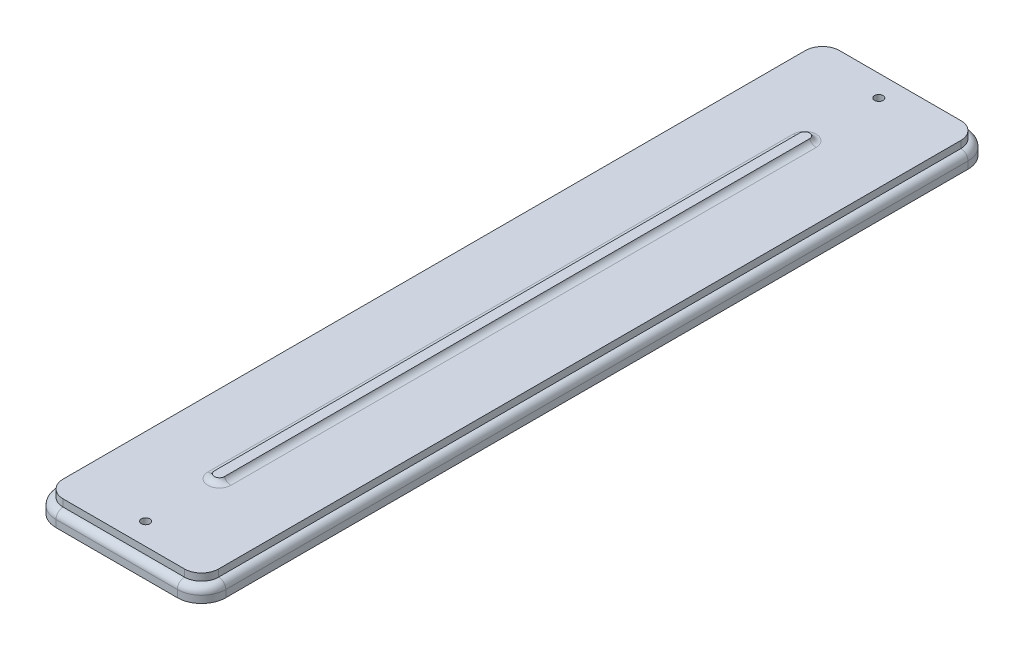
ISO-10303-21;
HEADER;
FILE_DESCRIPTION(('STEP AP214'),'2;1');
FILE_NAME('part.step','',(''),(''),'','','');
FILE_SCHEMA(('AUTOMOTIVE_DESIGN { 1 0 10303 214 1 1 1 1 }'));
ENDSEC;
DATA;
#1=APPLICATION_CONTEXT('core data for automotive mechanical design processes');
#2=APPLICATION_PROTOCOL_DEFINITION('international standard','automotive_design',2000,#1);
#3=PRODUCT_CONTEXT('',#1,'mechanical');
#4=PRODUCT('Part','Part','',(#3));
#5=PRODUCT_RELATED_PRODUCT_CATEGORY('part','',(#4));
#6=PRODUCT_DEFINITION_FORMATION('','',#4);
#7=PRODUCT_DEFINITION_CONTEXT('part definition',#1,'design');
#8=PRODUCT_DEFINITION('design','',#6,#7);
#9=PRODUCT_DEFINITION_SHAPE('','',#8);
#10=(LENGTH_UNIT() NAMED_UNIT(*) SI_UNIT(.MILLI.,.METRE.));
#11=(NAMED_UNIT(*) PLANE_ANGLE_UNIT() SI_UNIT($,.RADIAN.));
#12=(NAMED_UNIT(*) SI_UNIT($,.STERADIAN.) SOLID_ANGLE_UNIT());
#13=UNCERTAINTY_MEASURE_WITH_UNIT(LENGTH_MEASURE(1.E-05),#10,'distance_accuracy_value','');
#14=(GEOMETRIC_REPRESENTATION_CONTEXT(3) GLOBAL_UNCERTAINTY_ASSIGNED_CONTEXT((#13)) GLOBAL_UNIT_ASSIGNED_CONTEXT((#10,
#11,#12)) REPRESENTATION_CONTEXT('',''));
#15=CARTESIAN_POINT('',(0.,0.,0.));
#16=DIRECTION('',(0.,0.,1.));
#17=DIRECTION('',(1.,0.,0.));
#18=AXIS2_PLACEMENT_3D('',#15,#16,#17);
#19=CARTESIAN_POINT('',(-42.5,-15.,260.));
#20=DIRECTION('',(0.,1.,0.));
#21=DIRECTION('',(0.,0.,1.));
#22=AXIS2_PLACEMENT_3D('',#19,#20,#21);
#23=PLANE('',#22);
#24=CARTESIAN_POINT('',(-42.5,-15.,260.));
#25=DIRECTION('',(0.,-1.,0.));
#26=DIRECTION('',(0.,0.,1.));
#27=AXIS2_PLACEMENT_3D('',#24,#25,#26);
#28=CIRCLE('',#27,17.);
#29=CARTESIAN_POINT('',(-42.5,-15.,277.));
#30=VERTEX_POINT('',#29);
#31=CARTESIAN_POINT('',(-59.5,-15.,260.));
#32=VERTEX_POINT('',#31);
#33=EDGE_CURVE('E203',#30,#32,#28,.T.);
#34=ORIENTED_EDGE('',*,*,#33,.T.);
#35=DIRECTION('',(0.,0.,-1.));
#36=VECTOR('',#35,1.);
#37=CARTESIAN_POINT('',(-59.5,-15.,260.));
#38=LINE('',#37,#36);
#39=CARTESIAN_POINT('',(-59.5,-15.,-260.));
#40=VERTEX_POINT('',#39);
#41=EDGE_CURVE('E281',#32,#40,#38,.T.);
#42=ORIENTED_EDGE('',*,*,#41,.T.);
#43=CARTESIAN_POINT('',(-42.5,-15.,-260.));
#44=DIRECTION('',(0.,-1.,0.));
#45=DIRECTION('',(0.,0.,-1.));
#46=AXIS2_PLACEMENT_3D('',#43,#44,#45);
#47=CIRCLE('',#46,17.);
#48=CARTESIAN_POINT('',(-42.5,-15.,-277.));
#49=VERTEX_POINT('',#48);
#50=EDGE_CURVE('E284',#40,#49,#47,.T.);
#51=ORIENTED_EDGE('',*,*,#50,.T.);
#52=DIRECTION('',(1.,0.,0.));
#53=VECTOR('',#52,1.);
#54=CARTESIAN_POINT('',(-42.5,-15.,-277.));
#55=LINE('',#54,#53);
#56=CARTESIAN_POINT('',(42.5,-15.,-277.));
#57=VERTEX_POINT('',#56);
#58=EDGE_CURVE('E287',#49,#57,#55,.T.);
#59=ORIENTED_EDGE('',*,*,#58,.T.);
#60=CARTESIAN_POINT('',(42.5,-15.,-260.));
#61=DIRECTION('',(0.,-1.,0.));
#62=DIRECTION('',(0.,0.,-1.));
#63=AXIS2_PLACEMENT_3D('',#60,#61,#62);
#64=CIRCLE('',#63,17.0000000000001);
#65=CARTESIAN_POINT('',(59.5000000000001,-15.,-260.));
#66=VERTEX_POINT('',#65);
#67=EDGE_CURVE('E290',#57,#66,#64,.T.);
#68=ORIENTED_EDGE('',*,*,#67,.T.);
#69=DIRECTION('',(0.,0.,1.));
#70=VECTOR('',#69,1.);
#71=CARTESIAN_POINT('',(59.5,-15.,260.));
#72=LINE('',#71,#70);
#73=CARTESIAN_POINT('',(59.5,-15.,260.));
#74=VERTEX_POINT('',#73);
#75=EDGE_CURVE('E293',#66,#74,#72,.T.);
#76=ORIENTED_EDGE('',*,*,#75,.T.);
#77=CARTESIAN_POINT('',(42.5,-15.,260.));
#78=DIRECTION('',(0.,-1.,0.));
#79=DIRECTION('',(0.,0.,-1.));
#80=AXIS2_PLACEMENT_3D('',#77,#78,#79);
#81=CIRCLE('',#80,17.);
#82=CARTESIAN_POINT('',(42.5,-15.,277.));
#83=VERTEX_POINT('',#82);
#84=EDGE_CURVE('E296',#74,#83,#81,.T.);
#85=ORIENTED_EDGE('',*,*,#84,.T.);
#86=DIRECTION('',(-1.,0.,0.));
#87=VECTOR('',#86,1.);
#88=CARTESIAN_POINT('',(-42.5,-15.,277.));
#89=LINE('',#88,#87);
#90=EDGE_CURVE('E299',#83,#30,#89,.T.);
#91=ORIENTED_EDGE('',*,*,#90,.T.);
#92=EDGE_LOOP('',(#34,#42,#51,#59,#68,#76,#85,#91));
#93=FACE_BOUND('',#92,.T.);
#94=CARTESIAN_POINT('',(-42.5,-15.,260.));
#95=DIRECTION('',(0.,-1.,0.));
#96=DIRECTION('',(0.,0.,1.));
#97=AXIS2_PLACEMENT_3D('',#94,#95,#96);
#98=CIRCLE('',#97,12.);
#99=CARTESIAN_POINT('',(-42.5,-15.,272.));
#100=VERTEX_POINT('',#99);
#101=CARTESIAN_POINT('',(-54.5,-15.,260.));
#102=VERTEX_POINT('',#101);
#103=EDGE_CURVE('E182',#100,#102,#98,.T.);
#104=ORIENTED_EDGE('',*,*,#103,.F.);
#105=DIRECTION('',(-1.,0.,0.));
#106=VECTOR('',#105,1.);
#107=CARTESIAN_POINT('',(-42.5,-15.,272.));
#108=LINE('',#107,#106);
#109=CARTESIAN_POINT('',(42.5,-15.,272.));
#110=VERTEX_POINT('',#109);
#111=EDGE_CURVE('E228',#110,#100,#108,.T.);
#112=ORIENTED_EDGE('',*,*,#111,.F.);
#113=CARTESIAN_POINT('',(42.5,-15.,260.));
#114=DIRECTION('',(0.,-1.,0.));
#115=DIRECTION('',(0.,0.,1.));
#116=AXIS2_PLACEMENT_3D('',#113,#114,#115);
#117=CIRCLE('',#116,12.);
#118=CARTESIAN_POINT('',(54.5,-15.,260.));
#119=VERTEX_POINT('',#118);
#120=EDGE_CURVE('E224',#119,#110,#117,.T.);
#121=ORIENTED_EDGE('',*,*,#120,.F.);
#122=DIRECTION('',(0.,0.,1.));
#123=VECTOR('',#122,1.);
#124=CARTESIAN_POINT('',(54.5,-15.,-260.));
#125=LINE('',#124,#123);
#126=CARTESIAN_POINT('',(54.5,-15.,-260.));
#127=VERTEX_POINT('',#126);
#128=EDGE_CURVE('E221',#127,#119,#125,.T.);
#129=ORIENTED_EDGE('',*,*,#128,.F.);
#130=CARTESIAN_POINT('',(42.5,-15.,-260.));
#131=DIRECTION('',(0.,-1.,0.));
#132=DIRECTION('',(0.,0.,-1.));
#133=AXIS2_PLACEMENT_3D('',#130,#131,#132);
#134=CIRCLE('',#133,12.);
#135=CARTESIAN_POINT('',(42.5,-15.,-272.));
#136=VERTEX_POINT('',#135);
#137=EDGE_CURVE('E218',#136,#127,#134,.T.);
#138=ORIENTED_EDGE('',*,*,#137,.F.);
#139=DIRECTION('',(1.,0.,0.));
#140=VECTOR('',#139,1.);
#141=CARTESIAN_POINT('',(-42.5,-15.,-272.));
#142=LINE('',#141,#140);
#143=CARTESIAN_POINT('',(-42.5,-15.,-272.));
#144=VERTEX_POINT('',#143);
#145=EDGE_CURVE('E213',#144,#136,#142,.T.);
#146=ORIENTED_EDGE('',*,*,#145,.F.);
#147=CARTESIAN_POINT('',(-42.5,-15.,-260.));
#148=DIRECTION('',(0.,-1.,0.));
#149=DIRECTION('',(0.,0.,-1.));
#150=AXIS2_PLACEMENT_3D('',#147,#148,#149);
#151=CIRCLE('',#150,12.);
#152=CARTESIAN_POINT('',(-54.5,-15.,-260.));
#153=VERTEX_POINT('',#152);
#154=EDGE_CURVE('E208',#153,#144,#151,.T.);
#155=ORIENTED_EDGE('',*,*,#154,.F.);
#156=DIRECTION('',(0.,0.,-1.));
#157=VECTOR('',#156,1.);
#158=CARTESIAN_POINT('',(-54.5,-15.,260.));
#159=LINE('',#158,#157);
#160=EDGE_CURVE('E194',#102,#153,#159,.T.);
#161=ORIENTED_EDGE('',*,*,#160,.F.);
#162=EDGE_LOOP('',(#104,#112,#121,#129,#138,#146,#155,#161));
#163=FACE_BOUND('',#162,.T.);
#164=ADVANCED_FACE('F65',(#93,#163),#23,.F.);
#165=CARTESIAN_POINT('',(-42.5,-15.,260.));
#166=DIRECTION('',(0.,1.,0.));
#167=DIRECTION('',(0.,0.,1.));
#168=AXIS2_PLACEMENT_3D('',#165,#166,#167);
#169=CYLINDRICAL_SURFACE('',#168,17.);
#170=DIRECTION('',(0.,1.,0.));
#171=VECTOR('',#170,1.);
#172=CARTESIAN_POINT('',(-42.5,-15.,277.));
#173=LINE('',#172,#171);
#174=CARTESIAN_POINT('',(-42.5,-10.,277.));
#175=VERTEX_POINT('',#174);
#176=EDGE_CURVE('E302',#30,#175,#173,.T.);
#177=ORIENTED_EDGE('',*,*,#176,.T.);
#178=CARTESIAN_POINT('',(-42.5,-10.,260.));
#179=DIRECTION('',(0.,1.,0.));
#180=DIRECTION('',(0.,0.,1.));
#181=AXIS2_PLACEMENT_3D('',#178,#179,#180);
#182=CIRCLE('',#181,17.);
#183=CARTESIAN_POINT('',(-59.5,-10.,260.));
#184=VERTEX_POINT('',#183);
#185=EDGE_CURVE('E331',#175,#184,#182,.F.);
#186=ORIENTED_EDGE('',*,*,#185,.T.);
#187=DIRECTION('',(0.,1.,0.));
#188=VECTOR('',#187,1.);
#189=CARTESIAN_POINT('',(-59.5,-15.,260.));
#190=LINE('',#189,#188);
#191=EDGE_CURVE('E328',#32,#184,#190,.T.);
#192=ORIENTED_EDGE('',*,*,#191,.F.);
#193=ORIENTED_EDGE('',*,*,#33,.F.);
#194=EDGE_LOOP('',(#177,#186,#192,#193));
#195=FACE_BOUND('',#194,.T.);
#196=ADVANCED_FACE('F422',(#195),#169,.T.);
#197=CARTESIAN_POINT('',(-59.5,-15.,260.));
#198=DIRECTION('',(1.,0.,0.));
#199=DIRECTION('',(0.,0.,-1.));
#200=AXIS2_PLACEMENT_3D('',#197,#198,#199);
#201=PLANE('',#200);
#202=ORIENTED_EDGE('',*,*,#191,.T.);
#203=DIRECTION('',(0.,0.,-1.));
#204=VECTOR('',#203,1.);
#205=CARTESIAN_POINT('',(-59.4999999999999,-10.,-260.));
#206=LINE('',#205,#204);
#207=CARTESIAN_POINT('',(-59.5,-10.,-260.));
#208=VERTEX_POINT('',#207);
#209=EDGE_CURVE('E14',#184,#208,#206,.T.);
#210=ORIENTED_EDGE('',*,*,#209,.T.);
#211=DIRECTION('',(0.,1.,0.));
#212=VECTOR('',#211,1.);
#213=CARTESIAN_POINT('',(-59.5,-15.,-260.));
#214=LINE('',#213,#212);
#215=EDGE_CURVE('E325',#40,#208,#214,.T.);
#216=ORIENTED_EDGE('',*,*,#215,.F.);
#217=ORIENTED_EDGE('',*,*,#41,.F.);
#218=EDGE_LOOP('',(#202,#210,#216,#217));
#219=FACE_BOUND('',#218,.T.);
#220=ADVANCED_FACE('F466',(#219),#201,.F.);
#221=CARTESIAN_POINT('',(-42.5,-15.,-260.));
#222=DIRECTION('',(0.,1.,0.));
#223=DIRECTION('',(0.,0.,1.));
#224=AXIS2_PLACEMENT_3D('',#221,#222,#223);
#225=CYLINDRICAL_SURFACE('',#224,17.);
#226=ORIENTED_EDGE('',*,*,#215,.T.);
#227=CARTESIAN_POINT('',(-42.5,-10.,-260.));
#228=DIRECTION('',(0.,1.,0.));
#229=DIRECTION('',(0.,0.,1.));
#230=AXIS2_PLACEMENT_3D('',#227,#228,#229);
#231=CIRCLE('',#230,17.);
#232=CARTESIAN_POINT('',(-42.5,-10.,-277.));
#233=VERTEX_POINT('',#232);
#234=EDGE_CURVE('E75',#208,#233,#231,.F.);
#235=ORIENTED_EDGE('',*,*,#234,.T.);
#236=DIRECTION('',(0.,1.,0.));
#237=VECTOR('',#236,1.);
#238=CARTESIAN_POINT('',(-42.5,-15.,-277.));
#239=LINE('',#238,#237);
#240=EDGE_CURVE('E322',#49,#233,#239,.T.);
#241=ORIENTED_EDGE('',*,*,#240,.F.);
#242=ORIENTED_EDGE('',*,*,#50,.F.);
#243=EDGE_LOOP('',(#226,#235,#241,#242));
#244=FACE_BOUND('',#243,.T.);
#245=ADVANCED_FACE('F481',(#244),#225,.T.);
#246=CARTESIAN_POINT('',(-42.5,-15.,-277.));
#247=DIRECTION('',(0.,0.,1.));
#248=DIRECTION('',(1.,0.,0.));
#249=AXIS2_PLACEMENT_3D('',#246,#247,#248);
#250=PLANE('',#249);
#251=ORIENTED_EDGE('',*,*,#240,.T.);
#252=DIRECTION('',(1.,0.,0.));
#253=VECTOR('',#252,1.);
#254=CARTESIAN_POINT('',(42.5,-10.,-277.));
#255=LINE('',#254,#253);
#256=CARTESIAN_POINT('',(42.5,-10.,-277.));
#257=VERTEX_POINT('',#256);
#258=EDGE_CURVE('E347',#233,#257,#255,.T.);
#259=ORIENTED_EDGE('',*,*,#258,.T.);
#260=DIRECTION('',(0.,1.,0.));
#261=VECTOR('',#260,1.);
#262=CARTESIAN_POINT('',(42.5,-15.,-277.));
#263=LINE('',#262,#261);
#264=EDGE_CURVE('E318',#57,#257,#263,.T.);
#265=ORIENTED_EDGE('',*,*,#264,.F.);
#266=ORIENTED_EDGE('',*,*,#58,.F.);
#267=EDGE_LOOP('',(#251,#259,#265,#266));
#268=FACE_BOUND('',#267,.T.);
#269=ADVANCED_FACE('F439',(#268),#250,.F.);
#270=CARTESIAN_POINT('',(42.5,-15.,-260.));
#271=DIRECTION('',(0.,1.,0.));
#272=DIRECTION('',(0.,0.,1.));
#273=AXIS2_PLACEMENT_3D('',#270,#271,#272);
#274=CYLINDRICAL_SURFACE('',#273,17.0000000000001);
#275=ORIENTED_EDGE('',*,*,#264,.T.);
#276=CARTESIAN_POINT('',(42.5,-10.,-260.));
#277=DIRECTION('',(0.,1.,0.));
#278=DIRECTION('',(0.,0.,1.));
#279=AXIS2_PLACEMENT_3D('',#276,#277,#278);
#280=CIRCLE('',#279,17.0000000000001);
#281=CARTESIAN_POINT('',(59.5000000000001,-10.,-260.));
#282=VERTEX_POINT('',#281);
#283=EDGE_CURVE('E344',#257,#282,#280,.F.);
#284=ORIENTED_EDGE('',*,*,#283,.T.);
#285=DIRECTION('',(0.,1.,0.));
#286=VECTOR('',#285,1.);
#287=CARTESIAN_POINT('',(59.5000000000001,-15.,-260.));
#288=LINE('',#287,#286);
#289=EDGE_CURVE('E314',#66,#282,#288,.T.);
#290=ORIENTED_EDGE('',*,*,#289,.F.);
#291=ORIENTED_EDGE('',*,*,#67,.F.);
#292=EDGE_LOOP('',(#275,#284,#290,#291));
#293=FACE_BOUND('',#292,.T.);
#294=ADVANCED_FACE('F435',(#293),#274,.T.);
#295=CARTESIAN_POINT('',(59.5,-15.,260.));
#296=DIRECTION('',(-1.,0.,0.));
#297=DIRECTION('',(0.,0.,1.));
#298=AXIS2_PLACEMENT_3D('',#295,#296,#297);
#299=PLANE('',#298);
#300=ORIENTED_EDGE('',*,*,#289,.T.);
#301=DIRECTION('',(0.,0.,1.));
#302=VECTOR('',#301,1.);
#303=CARTESIAN_POINT('',(59.5,-10.,260.));
#304=LINE('',#303,#302);
#305=CARTESIAN_POINT('',(59.5,-10.,260.));
#306=VERTEX_POINT('',#305);
#307=EDGE_CURVE('E341',#282,#306,#304,.T.);
#308=ORIENTED_EDGE('',*,*,#307,.T.);
#309=DIRECTION('',(0.,1.,0.));
#310=VECTOR('',#309,1.);
#311=CARTESIAN_POINT('',(59.5,-15.,260.));
#312=LINE('',#311,#310);
#313=EDGE_CURVE('E310',#74,#306,#312,.T.);
#314=ORIENTED_EDGE('',*,*,#313,.F.);
#315=ORIENTED_EDGE('',*,*,#75,.F.);
#316=EDGE_LOOP('',(#300,#308,#314,#315));
#317=FACE_BOUND('',#316,.T.);
#318=ADVANCED_FACE('F431',(#317),#299,.F.);
#319=CARTESIAN_POINT('',(42.5,-15.,260.));
#320=DIRECTION('',(0.,1.,0.));
#321=DIRECTION('',(0.,0.,1.));
#322=AXIS2_PLACEMENT_3D('',#319,#320,#321);
#323=CYLINDRICAL_SURFACE('',#322,17.);
#324=ORIENTED_EDGE('',*,*,#313,.T.);
#325=CARTESIAN_POINT('',(42.5,-10.,260.));
#326=DIRECTION('',(0.,1.,0.));
#327=DIRECTION('',(0.,0.,1.));
#328=AXIS2_PLACEMENT_3D('',#325,#326,#327);
#329=CIRCLE('',#328,17.);
#330=CARTESIAN_POINT('',(42.5,-10.,277.));
#331=VERTEX_POINT('',#330);
#332=EDGE_CURVE('E338',#306,#331,#329,.F.);
#333=ORIENTED_EDGE('',*,*,#332,.T.);
#334=DIRECTION('',(0.,1.,0.));
#335=VECTOR('',#334,1.);
#336=CARTESIAN_POINT('',(42.5,-15.,277.));
#337=LINE('',#336,#335);
#338=EDGE_CURVE('E306',#83,#331,#337,.T.);
#339=ORIENTED_EDGE('',*,*,#338,.F.);
#340=ORIENTED_EDGE('',*,*,#84,.F.);
#341=EDGE_LOOP('',(#324,#333,#339,#340));
#342=FACE_BOUND('',#341,.T.);
#343=ADVANCED_FACE('F429',(#342),#323,.T.);
#344=CARTESIAN_POINT('',(-42.5,-15.,277.));
#345=DIRECTION('',(0.,0.,-1.));
#346=DIRECTION('',(-1.,0.,0.));
#347=AXIS2_PLACEMENT_3D('',#344,#345,#346);
#348=PLANE('',#347);
#349=ORIENTED_EDGE('',*,*,#338,.T.);
#350=DIRECTION('',(-1.,0.,0.));
#351=VECTOR('',#350,1.);
#352=CARTESIAN_POINT('',(-42.5,-10.,277.));
#353=LINE('',#352,#351);
#354=EDGE_CURVE('E335',#331,#175,#353,.T.);
#355=ORIENTED_EDGE('',*,*,#354,.T.);
#356=ORIENTED_EDGE('',*,*,#176,.F.);
#357=ORIENTED_EDGE('',*,*,#90,.F.);
#358=EDGE_LOOP('',(#349,#355,#356,#357));
#359=FACE_BOUND('',#358,.T.);
#360=ADVANCED_FACE('F417',(#359),#348,.F.);
#361=CARTESIAN_POINT('',(-42.5,-15.,260.));
#362=DIRECTION('',(0.,1.,0.));
#363=DIRECTION('',(0.,0.,1.));
#364=AXIS2_PLACEMENT_3D('',#361,#362,#363);
#365=CYLINDRICAL_SURFACE('',#364,12.);
#366=CARTESIAN_POINT('',(-42.5,-5.,260.));
#367=DIRECTION('',(0.,-1.,0.));
#368=DIRECTION('',(0.,0.,1.));
#369=AXIS2_PLACEMENT_3D('',#366,#367,#368);
#370=CIRCLE('',#369,12.);
#371=CARTESIAN_POINT('',(-42.5,-5.,272.));
#372=VERTEX_POINT('',#371);
#373=CARTESIAN_POINT('',(-54.5,-5.,260.));
#374=VERTEX_POINT('',#373);
#375=EDGE_CURVE('E231',#372,#374,#370,.T.);
#376=ORIENTED_EDGE('',*,*,#375,.F.);
#377=DIRECTION('',(0.,1.,0.));
#378=VECTOR('',#377,1.);
#379=CARTESIAN_POINT('',(-42.5,-15.,272.));
#380=LINE('',#379,#378);
#381=EDGE_CURVE('E189',#100,#372,#380,.T.);
#382=ORIENTED_EDGE('',*,*,#381,.F.);
#383=ORIENTED_EDGE('',*,*,#103,.T.);
#384=DIRECTION('',(0.,1.,0.));
#385=VECTOR('',#384,1.);
#386=CARTESIAN_POINT('',(-54.5,-15.,260.));
#387=LINE('',#386,#385);
#388=EDGE_CURVE('E186',#102,#374,#387,.T.);
#389=ORIENTED_EDGE('',*,*,#388,.T.);
#390=EDGE_LOOP('',(#376,#382,#383,#389));
#391=FACE_BOUND('',#390,.T.);
#392=ADVANCED_FACE('F185',(#391),#365,.F.);
#393=CARTESIAN_POINT('',(-54.5,-15.,260.));
#394=DIRECTION('',(1.,0.,0.));
#395=DIRECTION('',(0.,0.,-1.));
#396=AXIS2_PLACEMENT_3D('',#393,#394,#395);
#397=PLANE('',#396);
#398=DIRECTION('',(0.,0.,-1.));
#399=VECTOR('',#398,1.);
#400=CARTESIAN_POINT('',(-54.5,-5.,260.));
#401=LINE('',#400,#399);
#402=CARTESIAN_POINT('',(-54.5,-5.,-260.));
#403=VERTEX_POINT('',#402);
#404=EDGE_CURVE('E201',#374,#403,#401,.T.);
#405=ORIENTED_EDGE('',*,*,#404,.F.);
#406=ORIENTED_EDGE('',*,*,#388,.F.);
#407=ORIENTED_EDGE('',*,*,#160,.T.);
#408=DIRECTION('',(0.,1.,0.));
#409=VECTOR('',#408,1.);
#410=CARTESIAN_POINT('',(-54.5,-15.,-260.));
#411=LINE('',#410,#409);
#412=EDGE_CURVE('E204',#153,#403,#411,.T.);
#413=ORIENTED_EDGE('',*,*,#412,.T.);
#414=EDGE_LOOP('',(#405,#406,#407,#413));
#415=FACE_BOUND('',#414,.T.);
#416=ADVANCED_FACE('F198',(#415),#397,.T.);
#417=CARTESIAN_POINT('',(-42.5,-15.,-260.));
#418=DIRECTION('',(0.,1.,0.));
#419=DIRECTION('',(0.,0.,1.));
#420=AXIS2_PLACEMENT_3D('',#417,#418,#419);
#421=CYLINDRICAL_SURFACE('',#420,12.);
#422=CARTESIAN_POINT('',(-42.5,-5.,-260.));
#423=DIRECTION('',(0.,-1.,0.));
#424=DIRECTION('',(0.,0.,-1.));
#425=AXIS2_PLACEMENT_3D('',#422,#423,#424);
#426=CIRCLE('',#425,12.);
#427=CARTESIAN_POINT('',(-42.5,-5.,-272.));
#428=VERTEX_POINT('',#427);
#429=EDGE_CURVE('E236',#403,#428,#426,.T.);
#430=ORIENTED_EDGE('',*,*,#429,.F.);
#431=ORIENTED_EDGE('',*,*,#412,.F.);
#432=ORIENTED_EDGE('',*,*,#154,.T.);
#433=DIRECTION('',(0.,1.,0.));
#434=VECTOR('',#433,1.);
#435=CARTESIAN_POINT('',(-42.5,-15.,-272.));
#436=LINE('',#435,#434);
#437=EDGE_CURVE('E273',#144,#428,#436,.T.);
#438=ORIENTED_EDGE('',*,*,#437,.T.);
#439=EDGE_LOOP('',(#430,#431,#432,#438));
#440=FACE_BOUND('',#439,.T.);
#441=ADVANCED_FACE('F447',(#440),#421,.F.);
#442=CARTESIAN_POINT('',(-42.5,-15.,-272.));
#443=DIRECTION('',(0.,0.,1.));
#444=DIRECTION('',(1.,0.,0.));
#445=AXIS2_PLACEMENT_3D('',#442,#443,#444);
#446=PLANE('',#445);
#447=DIRECTION('',(1.,0.,0.));
#448=VECTOR('',#447,1.);
#449=CARTESIAN_POINT('',(-42.5,-5.,-272.));
#450=LINE('',#449,#448);
#451=CARTESIAN_POINT('',(42.5,-5.,-272.));
#452=VERTEX_POINT('',#451);
#453=EDGE_CURVE('E240',#428,#452,#450,.T.);
#454=ORIENTED_EDGE('',*,*,#453,.F.);
#455=ORIENTED_EDGE('',*,*,#437,.F.);
#456=ORIENTED_EDGE('',*,*,#145,.T.);
#457=DIRECTION('',(0.,1.,0.));
#458=VECTOR('',#457,1.);
#459=CARTESIAN_POINT('',(42.5,-15.,-272.));
#460=LINE('',#459,#458);
#461=EDGE_CURVE('E270',#136,#452,#460,.T.);
#462=ORIENTED_EDGE('',*,*,#461,.T.);
#463=EDGE_LOOP('',(#454,#455,#456,#462));
#464=FACE_BOUND('',#463,.T.);
#465=ADVANCED_FACE('F451',(#464),#446,.T.);
#466=CARTESIAN_POINT('',(42.5,-15.,-260.));
#467=DIRECTION('',(0.,1.,0.));
#468=DIRECTION('',(0.,0.,1.));
#469=AXIS2_PLACEMENT_3D('',#466,#467,#468);
#470=CYLINDRICAL_SURFACE('',#469,12.);
#471=CARTESIAN_POINT('',(42.5,-5.,-260.));
#472=DIRECTION('',(0.,-1.,0.));
#473=DIRECTION('',(0.,0.,-1.));
#474=AXIS2_PLACEMENT_3D('',#471,#472,#473);
#475=CIRCLE('',#474,12.);
#476=CARTESIAN_POINT('',(54.5,-5.,-260.));
#477=VERTEX_POINT('',#476);
#478=EDGE_CURVE('E244',#452,#477,#475,.T.);
#479=ORIENTED_EDGE('',*,*,#478,.F.);
#480=ORIENTED_EDGE('',*,*,#461,.F.);
#481=ORIENTED_EDGE('',*,*,#137,.T.);
#482=DIRECTION('',(0.,1.,0.));
#483=VECTOR('',#482,1.);
#484=CARTESIAN_POINT('',(54.5,-15.,-260.));
#485=LINE('',#484,#483);
#486=EDGE_CURVE('E267',#127,#477,#485,.T.);
#487=ORIENTED_EDGE('',*,*,#486,.T.);
#488=EDGE_LOOP('',(#479,#480,#481,#487));
#489=FACE_BOUND('',#488,.T.);
#490=ADVANCED_FACE('F394',(#489),#470,.F.);
#491=CARTESIAN_POINT('',(54.5,-15.,-260.));
#492=DIRECTION('',(-1.,0.,0.));
#493=DIRECTION('',(0.,0.,1.));
#494=AXIS2_PLACEMENT_3D('',#491,#492,#493);
#495=PLANE('',#494);
#496=DIRECTION('',(0.,0.,1.));
#497=VECTOR('',#496,1.);
#498=CARTESIAN_POINT('',(54.5,-5.,-260.));
#499=LINE('',#498,#497);
#500=CARTESIAN_POINT('',(54.5,-5.,260.));
#501=VERTEX_POINT('',#500);
#502=EDGE_CURVE('E248',#477,#501,#499,.T.);
#503=ORIENTED_EDGE('',*,*,#502,.F.);
#504=ORIENTED_EDGE('',*,*,#486,.F.);
#505=ORIENTED_EDGE('',*,*,#128,.T.);
#506=DIRECTION('',(0.,1.,0.));
#507=VECTOR('',#506,1.);
#508=CARTESIAN_POINT('',(54.5,-15.,260.));
#509=LINE('',#508,#507);
#510=EDGE_CURVE('E264',#119,#501,#509,.T.);
#511=ORIENTED_EDGE('',*,*,#510,.T.);
#512=EDGE_LOOP('',(#503,#504,#505,#511));
#513=FACE_BOUND('',#512,.T.);
#514=ADVANCED_FACE('F399',(#513),#495,.T.);
#515=CARTESIAN_POINT('',(42.5,-15.,260.));
#516=DIRECTION('',(0.,1.,0.));
#517=DIRECTION('',(0.,0.,1.));
#518=AXIS2_PLACEMENT_3D('',#515,#516,#517);
#519=CYLINDRICAL_SURFACE('',#518,12.);
#520=CARTESIAN_POINT('',(42.5,-5.,260.));
#521=DIRECTION('',(0.,-1.,0.));
#522=DIRECTION('',(0.,0.,1.));
#523=AXIS2_PLACEMENT_3D('',#520,#521,#522);
#524=CIRCLE('',#523,12.);
#525=CARTESIAN_POINT('',(42.5,-5.,272.));
#526=VERTEX_POINT('',#525);
#527=EDGE_CURVE('E252',#501,#526,#524,.T.);
#528=ORIENTED_EDGE('',*,*,#527,.F.);
#529=ORIENTED_EDGE('',*,*,#510,.F.);
#530=ORIENTED_EDGE('',*,*,#120,.T.);
#531=DIRECTION('',(0.,1.,0.));
#532=VECTOR('',#531,1.);
#533=CARTESIAN_POINT('',(42.5,-15.,272.));
#534=LINE('',#533,#532);
#535=EDGE_CURVE('E261',#110,#526,#534,.T.);
#536=ORIENTED_EDGE('',*,*,#535,.T.);
#537=EDGE_LOOP('',(#528,#529,#530,#536));
#538=FACE_BOUND('',#537,.T.);
#539=ADVANCED_FACE('F404',(#538),#519,.F.);
#540=CARTESIAN_POINT('',(-42.5,-15.,272.));
#541=DIRECTION('',(0.,0.,-1.));
#542=DIRECTION('',(-1.,0.,0.));
#543=AXIS2_PLACEMENT_3D('',#540,#541,#542);
#544=PLANE('',#543);
#545=DIRECTION('',(-1.,0.,0.));
#546=VECTOR('',#545,1.);
#547=CARTESIAN_POINT('',(-42.5,-5.,272.));
#548=LINE('',#547,#546);
#549=EDGE_CURVE('E195',#526,#372,#548,.T.);
#550=ORIENTED_EDGE('',*,*,#549,.F.);
#551=ORIENTED_EDGE('',*,*,#535,.F.);
#552=ORIENTED_EDGE('',*,*,#111,.T.);
#553=ORIENTED_EDGE('',*,*,#381,.T.);
#554=EDGE_LOOP('',(#550,#551,#552,#553));
#555=FACE_BOUND('',#554,.T.);
#556=ADVANCED_FACE('F453',(#555),#544,.T.);
#557=CARTESIAN_POINT('',(42.5,-10.,-260.));
#558=DIRECTION('',(0.,1.,0.));
#559=DIRECTION('',(0.,0.,1.));
#560=AXIS2_PLACEMENT_3D('',#557,#558,#559);
#561=TOROIDAL_SURFACE('',#560,12.0000000000001,5.);
#562=CARTESIAN_POINT('',(42.5,-10.,-272.));
#563=DIRECTION('',(-1.,0.,0.));
#564=DIRECTION('',(0.,0.,1.));
#565=AXIS2_PLACEMENT_3D('',#562,#563,#564);
#566=CIRCLE('',#565,5.);
#567=EDGE_CURVE('E373',#452,#257,#566,.T.);
#568=ORIENTED_EDGE('',*,*,#567,.F.);
#569=ORIENTED_EDGE('',*,*,#478,.T.);
#570=CARTESIAN_POINT('',(54.5000000000001,-10.,-260.));
#571=DIRECTION('',(0.,0.,1.));
#572=DIRECTION('',(1.,0.,0.));
#573=AXIS2_PLACEMENT_3D('',#570,#571,#572);
#574=CIRCLE('',#573,5.);
#575=EDGE_CURVE('E69',#282,#477,#574,.T.);
#576=ORIENTED_EDGE('',*,*,#575,.F.);
#577=ORIENTED_EDGE('',*,*,#283,.F.);
#578=EDGE_LOOP('',(#568,#569,#576,#577));
#579=FACE_BOUND('',#578,.T.);
#580=ADVANCED_FACE('F67',(#579),#561,.T.);
#581=CARTESIAN_POINT('',(54.5,-10.,260.));
#582=DIRECTION('',(0.,0.,-1.));
#583=DIRECTION('',(-1.,0.,0.));
#584=AXIS2_PLACEMENT_3D('',#581,#582,#583);
#585=CYLINDRICAL_SURFACE('',#584,5.);
#586=ORIENTED_EDGE('',*,*,#575,.T.);
#587=ORIENTED_EDGE('',*,*,#502,.T.);
#588=CARTESIAN_POINT('',(54.5,-10.,260.));
#589=DIRECTION('',(0.,0.,1.));
#590=DIRECTION('',(1.,0.,0.));
#591=AXIS2_PLACEMENT_3D('',#588,#589,#590);
#592=CIRCLE('',#591,5.);
#593=EDGE_CURVE('E370',#306,#501,#592,.T.);
#594=ORIENTED_EDGE('',*,*,#593,.F.);
#595=ORIENTED_EDGE('',*,*,#307,.F.);
#596=EDGE_LOOP('',(#586,#587,#594,#595));
#597=FACE_BOUND('',#596,.T.);
#598=ADVANCED_FACE('F386',(#597),#585,.T.);
#599=CARTESIAN_POINT('',(-42.5,-10.,-272.));
#600=DIRECTION('',(-1.,0.,0.));
#601=DIRECTION('',(0.,0.,1.));
#602=AXIS2_PLACEMENT_3D('',#599,#600,#601);
#603=CYLINDRICAL_SURFACE('',#602,5.);
#604=ORIENTED_EDGE('',*,*,#567,.T.);
#605=ORIENTED_EDGE('',*,*,#258,.F.);
#606=CARTESIAN_POINT('',(-42.5,-10.,-272.));
#607=DIRECTION('',(-1.,0.,0.));
#608=DIRECTION('',(0.,0.,1.));
#609=AXIS2_PLACEMENT_3D('',#606,#607,#608);
#610=CIRCLE('',#609,5.);
#611=EDGE_CURVE('E366',#428,#233,#610,.T.);
#612=ORIENTED_EDGE('',*,*,#611,.F.);
#613=ORIENTED_EDGE('',*,*,#453,.T.);
#614=EDGE_LOOP('',(#604,#605,#612,#613));
#615=FACE_BOUND('',#614,.T.);
#616=ADVANCED_FACE('F441',(#615),#603,.T.);
#617=CARTESIAN_POINT('',(42.5,-10.,260.));
#618=DIRECTION('',(0.,1.,0.));
#619=DIRECTION('',(0.,0.,1.));
#620=AXIS2_PLACEMENT_3D('',#617,#618,#619);
#621=TOROIDAL_SURFACE('',#620,12.,5.);
#622=ORIENTED_EDGE('',*,*,#593,.T.);
#623=ORIENTED_EDGE('',*,*,#527,.T.);
#624=CARTESIAN_POINT('',(42.5,-10.,272.));
#625=DIRECTION('',(-1.,0.,0.));
#626=DIRECTION('',(0.,0.,1.));
#627=AXIS2_PLACEMENT_3D('',#624,#625,#626);
#628=CIRCLE('',#627,5.);
#629=EDGE_CURVE('E362',#331,#526,#628,.T.);
#630=ORIENTED_EDGE('',*,*,#629,.F.);
#631=ORIENTED_EDGE('',*,*,#332,.F.);
#632=EDGE_LOOP('',(#622,#623,#630,#631));
#633=FACE_BOUND('',#632,.T.);
#634=ADVANCED_FACE('F408',(#633),#621,.T.);
#635=CARTESIAN_POINT('',(-42.5,-10.,-260.));
#636=DIRECTION('',(0.,1.,0.));
#637=DIRECTION('',(0.,0.,1.));
#638=AXIS2_PLACEMENT_3D('',#635,#636,#637);
#639=TOROIDAL_SURFACE('',#638,12.,5.);
#640=ORIENTED_EDGE('',*,*,#611,.T.);
#641=ORIENTED_EDGE('',*,*,#234,.F.);
#642=CARTESIAN_POINT('',(-54.5,-10.,-260.));
#643=DIRECTION('',(0.,0.,1.));
#644=DIRECTION('',(1.,0.,0.));
#645=AXIS2_PLACEMENT_3D('',#642,#643,#644);
#646=CIRCLE('',#645,5.);
#647=EDGE_CURVE('E358',#403,#208,#646,.T.);
#648=ORIENTED_EDGE('',*,*,#647,.F.);
#649=ORIENTED_EDGE('',*,*,#429,.T.);
#650=EDGE_LOOP('',(#640,#641,#648,#649));
#651=FACE_BOUND('',#650,.T.);
#652=ADVANCED_FACE('F443',(#651),#639,.T.);
#653=CARTESIAN_POINT('',(-42.5,-10.,272.));
#654=DIRECTION('',(1.,0.,0.));
#655=DIRECTION('',(0.,0.,-1.));
#656=AXIS2_PLACEMENT_3D('',#653,#654,#655);
#657=CYLINDRICAL_SURFACE('',#656,5.);
#658=ORIENTED_EDGE('',*,*,#629,.T.);
#659=ORIENTED_EDGE('',*,*,#549,.T.);
#660=CARTESIAN_POINT('',(-42.5,-10.,272.));
#661=DIRECTION('',(-1.,0.,0.));
#662=DIRECTION('',(0.,0.,1.));
#663=AXIS2_PLACEMENT_3D('',#660,#661,#662);
#664=CIRCLE('',#663,5.);
#665=EDGE_CURVE('E355',#175,#372,#664,.T.);
#666=ORIENTED_EDGE('',*,*,#665,.F.);
#667=ORIENTED_EDGE('',*,*,#354,.F.);
#668=EDGE_LOOP('',(#658,#659,#666,#667));
#669=FACE_BOUND('',#668,.T.);
#670=ADVANCED_FACE('F412',(#669),#657,.T.);
#671=CARTESIAN_POINT('',(-54.5,-10.,260.));
#672=DIRECTION('',(0.,0.,1.));
#673=DIRECTION('',(1.,0.,0.));
#674=AXIS2_PLACEMENT_3D('',#671,#672,#673);
#675=CYLINDRICAL_SURFACE('',#674,5.);
#676=ORIENTED_EDGE('',*,*,#647,.T.);
#677=ORIENTED_EDGE('',*,*,#209,.F.);
#678=CARTESIAN_POINT('',(-54.5,-10.,260.));
#679=DIRECTION('',(0.,0.,1.));
#680=DIRECTION('',(1.,0.,0.));
#681=AXIS2_PLACEMENT_3D('',#678,#679,#680);
#682=CIRCLE('',#681,5.);
#683=EDGE_CURVE('E352',#374,#184,#682,.T.);
#684=ORIENTED_EDGE('',*,*,#683,.F.);
#685=ORIENTED_EDGE('',*,*,#404,.T.);
#686=EDGE_LOOP('',(#676,#677,#684,#685));
#687=FACE_BOUND('',#686,.T.);
#688=ADVANCED_FACE('F489',(#687),#675,.T.);
#689=CARTESIAN_POINT('',(-42.5,-10.,260.));
#690=DIRECTION('',(0.,1.,0.));
#691=DIRECTION('',(0.,0.,1.));
#692=AXIS2_PLACEMENT_3D('',#689,#690,#691);
#693=TOROIDAL_SURFACE('',#692,12.,5.);
#694=ORIENTED_EDGE('',*,*,#665,.T.);
#695=ORIENTED_EDGE('',*,*,#375,.T.);
#696=ORIENTED_EDGE('',*,*,#683,.T.);
#697=ORIENTED_EDGE('',*,*,#185,.F.);
#698=EDGE_LOOP('',(#694,#695,#696,#697));
#699=FACE_BOUND('',#698,.T.);
#700=ADVANCED_FACE('F486',(#699),#693,.T.);
#701=CLOSED_SHELL('',(#164,#196,#220,#245,#269,#294,#318,#343,#360,#392,#416,#441,#465,#490,
#514,#539,#556,#580,#598,#616,#634,#652,#670,#688,#700));
#702=MANIFOLD_SOLID_BREP('B2',#701);
#703=CARTESIAN_POINT('',(-42.5,0.,-260.));
#704=DIRECTION('',(0.,-1.,0.));
#705=DIRECTION('',(0.,0.,-1.));
#706=AXIS2_PLACEMENT_3D('',#703,#704,#705);
#707=PLANE('',#706);
#708=DIRECTION('',(0.,0.,1.));
#709=VECTOR('',#708,1.);
#710=CARTESIAN_POINT('',(8.08257569495583,0.,-260.));
#711=LINE('',#710,#709);
#712=CARTESIAN_POINT('',(8.08257569495583,0.,-205.));
#713=VERTEX_POINT('',#712);
#714=CARTESIAN_POINT('',(8.08257569495583,0.,205.));
#715=VERTEX_POINT('',#714);
#716=EDGE_CURVE('E975',#713,#715,#711,.T.);
#717=ORIENTED_EDGE('',*,*,#716,.T.);
#718=CARTESIAN_POINT('',(0.,0.,205.));
#719=DIRECTION('',(0.,-1.,0.));
#720=DIRECTION('',(0.,0.,-1.));
#721=AXIS2_PLACEMENT_3D('',#718,#719,#720);
#722=CIRCLE('',#721,8.08257569495585);
#723=CARTESIAN_POINT('',(-8.08257569495588,0.,205.));
#724=VERTEX_POINT('',#723);
#725=EDGE_CURVE('E63',#715,#724,#722,.T.);
#726=ORIENTED_EDGE('',*,*,#725,.T.);
#727=DIRECTION('',(0.,0.,-1.));
#728=VECTOR('',#727,1.);
#729=CARTESIAN_POINT('',(-8.08257569495588,0.,-260.));
#730=LINE('',#729,#728);
#731=CARTESIAN_POINT('',(-8.08257569495584,0.,-205.));
#732=VERTEX_POINT('',#731);
#733=EDGE_CURVE('E782',#724,#732,#730,.T.);
#734=ORIENTED_EDGE('',*,*,#733,.T.);
#735=CARTESIAN_POINT('',(0.,0.,-205.));
#736=DIRECTION('',(0.,-1.,0.));
#737=DIRECTION('',(0.,0.,-1.));
#738=AXIS2_PLACEMENT_3D('',#735,#736,#737);
#739=CIRCLE('',#738,8.08257569495585);
#740=EDGE_CURVE('E877',#732,#713,#739,.T.);
#741=ORIENTED_EDGE('',*,*,#740,.T.);
#742=EDGE_LOOP('',(#717,#726,#734,#741));
#743=FACE_BOUND('',#742,.T.);
#744=CARTESIAN_POINT('',(-42.5,0.,-260.));
#745=DIRECTION('',(0.,1.,0.));
#746=DIRECTION('',(0.,0.,-1.));
#747=AXIS2_PLACEMENT_3D('',#744,#745,#746);
#748=CIRCLE('',#747,12.);
#749=CARTESIAN_POINT('',(-42.5,0.,-272.));
#750=VERTEX_POINT('',#749);
#751=CARTESIAN_POINT('',(-54.5,0.,-260.));
#752=VERTEX_POINT('',#751);
#753=EDGE_CURVE('E904',#750,#752,#748,.T.);
#754=ORIENTED_EDGE('',*,*,#753,.T.);
#755=DIRECTION('',(0.,0.,1.));
#756=VECTOR('',#755,1.);
#757=CARTESIAN_POINT('',(-54.5,0.,-260.));
#758=LINE('',#757,#756);
#759=CARTESIAN_POINT('',(-54.5,0.,260.));
#760=VERTEX_POINT('',#759);
#761=EDGE_CURVE('E945',#752,#760,#758,.T.);
#762=ORIENTED_EDGE('',*,*,#761,.T.);
#763=CARTESIAN_POINT('',(-42.5,0.,260.));
#764=DIRECTION('',(0.,1.,0.));
#765=DIRECTION('',(0.,0.,1.));
#766=AXIS2_PLACEMENT_3D('',#763,#764,#765);
#767=CIRCLE('',#766,12.);
#768=CARTESIAN_POINT('',(-42.5,0.,272.));
#769=VERTEX_POINT('',#768);
#770=EDGE_CURVE('E949',#760,#769,#767,.T.);
#771=ORIENTED_EDGE('',*,*,#770,.T.);
#772=DIRECTION('',(1.,0.,0.));
#773=VECTOR('',#772,1.);
#774=CARTESIAN_POINT('',(-42.5,0.,272.));
#775=LINE('',#774,#773);
#776=CARTESIAN_POINT('',(42.5,0.,272.));
#777=VERTEX_POINT('',#776);
#778=EDGE_CURVE('E953',#769,#777,#775,.T.);
#779=ORIENTED_EDGE('',*,*,#778,.T.);
#780=CARTESIAN_POINT('',(42.5,0.,260.));
#781=DIRECTION('',(0.,1.,0.));
#782=DIRECTION('',(0.,0.,1.));
#783=AXIS2_PLACEMENT_3D('',#780,#781,#782);
#784=CIRCLE('',#783,12.);
#785=CARTESIAN_POINT('',(54.5,0.,260.));
#786=VERTEX_POINT('',#785);
#787=EDGE_CURVE('E957',#777,#786,#784,.T.);
#788=ORIENTED_EDGE('',*,*,#787,.T.);
#789=DIRECTION('',(0.,0.,-1.));
#790=VECTOR('',#789,1.);
#791=CARTESIAN_POINT('',(54.5,0.,-260.));
#792=LINE('',#791,#790);
#793=CARTESIAN_POINT('',(54.5,0.,-260.));
#794=VERTEX_POINT('',#793);
#795=EDGE_CURVE('E961',#786,#794,#792,.T.);
#796=ORIENTED_EDGE('',*,*,#795,.T.);
#797=CARTESIAN_POINT('',(42.5,0.,-260.));
#798=DIRECTION('',(0.,1.,0.));
#799=DIRECTION('',(0.,0.,-1.));
#800=AXIS2_PLACEMENT_3D('',#797,#798,#799);
#801=CIRCLE('',#800,12.);
#802=CARTESIAN_POINT('',(42.5,0.,-272.));
#803=VERTEX_POINT('',#802);
#804=EDGE_CURVE('E965',#794,#803,#801,.T.);
#805=ORIENTED_EDGE('',*,*,#804,.T.);
#806=DIRECTION('',(-1.,0.,0.));
#807=VECTOR('',#806,1.);
#808=CARTESIAN_POINT('',(-42.5,0.,-272.));
#809=LINE('',#808,#807);
#810=EDGE_CURVE('E913',#803,#750,#809,.T.);
#811=ORIENTED_EDGE('',*,*,#810,.T.);
#812=EDGE_LOOP('',(#754,#762,#771,#779,#788,#796,#805,#811));
#813=FACE_BOUND('',#812,.T.);
#814=CARTESIAN_POINT('',(0.,0.,-257.));
#815=DIRECTION('',(0.,1.,0.));
#816=DIRECTION('',(0.,0.,1.));
#817=AXIS2_PLACEMENT_3D('',#814,#815,#816);
#818=CIRCLE('',#817,3.);
#819=CARTESIAN_POINT('',(0.,0.,-254.));
#820=VERTEX_POINT('',#819);
#821=EDGE_CURVE('E896',#820,#820,#818,.T.);
#822=ORIENTED_EDGE('',*,*,#821,.F.);
#823=EDGE_LOOP('',(#822));
#824=FACE_BOUND('',#823,.T.);
#825=CARTESIAN_POINT('',(0.,0.,256.72));
#826=DIRECTION('',(0.,1.,0.));
#827=DIRECTION('',(0.,0.,1.));
#828=AXIS2_PLACEMENT_3D('',#825,#826,#827);
#829=CIRCLE('',#828,3.);
#830=CARTESIAN_POINT('',(0.,0.,259.72));
#831=VERTEX_POINT('',#830);
#832=EDGE_CURVE('E891',#831,#831,#829,.T.);
#833=ORIENTED_EDGE('',*,*,#832,.F.);
#834=EDGE_LOOP('',(#833));
#835=FACE_BOUND('',#834,.T.);
#836=ADVANCED_FACE('F772',(#743,#813,#824,#835),#707,.F.);
#837=CARTESIAN_POINT('',(-42.5,-5.,-260.));
#838=DIRECTION('',(0.,1.,0.));
#839=DIRECTION('',(0.,0.,1.));
#840=AXIS2_PLACEMENT_3D('',#837,#838,#839);
#841=CYLINDRICAL_SURFACE('',#840,12.);
#842=ORIENTED_EDGE('',*,*,#753,.F.);
#843=DIRECTION('',(0.,1.,0.));
#844=VECTOR('',#843,1.);
#845=CARTESIAN_POINT('',(-42.5,-5.,-272.));
#846=LINE('',#845,#844);
#847=CARTESIAN_POINT('',(-42.5,-5.,-272.));
#848=VERTEX_POINT('',#847);
#849=EDGE_CURVE('E972',#848,#750,#846,.T.);
#850=ORIENTED_EDGE('',*,*,#849,.F.);
#851=CARTESIAN_POINT('',(-42.5,-5.,-260.));
#852=DIRECTION('',(0.,1.,0.));
#853=DIRECTION('',(0.,0.,-1.));
#854=AXIS2_PLACEMENT_3D('',#851,#852,#853);
#855=CIRCLE('',#854,12.);
#856=CARTESIAN_POINT('',(-54.5,-5.,-260.));
#857=VERTEX_POINT('',#856);
#858=EDGE_CURVE('E908',#848,#857,#855,.T.);
#859=ORIENTED_EDGE('',*,*,#858,.T.);
#860=DIRECTION('',(0.,1.,0.));
#861=VECTOR('',#860,1.);
#862=CARTESIAN_POINT('',(-54.5,-5.,-260.));
#863=LINE('',#862,#861);
#864=EDGE_CURVE('E941',#857,#752,#863,.T.);
#865=ORIENTED_EDGE('',*,*,#864,.T.);
#866=EDGE_LOOP('',(#842,#850,#859,#865));
#867=FACE_BOUND('',#866,.T.);
#868=ADVANCED_FACE('F1022',(#867),#841,.T.);
#869=CARTESIAN_POINT('',(-42.5,-5.,-272.));
#870=DIRECTION('',(0.,0.,-1.));
#871=DIRECTION('',(-1.,0.,0.));
#872=AXIS2_PLACEMENT_3D('',#869,#870,#871);
#873=PLANE('',#872);
#874=ORIENTED_EDGE('',*,*,#810,.F.);
#875=DIRECTION('',(0.,1.,0.));
#876=VECTOR('',#875,1.);
#877=CARTESIAN_POINT('',(42.5,-5.,-272.));
#878=LINE('',#877,#876);
#879=CARTESIAN_POINT('',(42.5,-5.,-272.));
#880=VERTEX_POINT('',#879);
#881=EDGE_CURVE('E976',#880,#803,#878,.T.);
#882=ORIENTED_EDGE('',*,*,#881,.F.);
#883=DIRECTION('',(-1.,0.,0.));
#884=VECTOR('',#883,1.);
#885=CARTESIAN_POINT('',(-42.5,-5.,-272.));
#886=LINE('',#885,#884);
#887=EDGE_CURVE('E937',#880,#848,#886,.T.);
#888=ORIENTED_EDGE('',*,*,#887,.T.);
#889=ORIENTED_EDGE('',*,*,#849,.T.);
#890=EDGE_LOOP('',(#874,#882,#888,#889));
#891=FACE_BOUND('',#890,.T.);
#892=ADVANCED_FACE('F1027',(#891),#873,.T.);
#893=CARTESIAN_POINT('',(42.5,-5.,-260.));
#894=DIRECTION('',(0.,1.,0.));
#895=DIRECTION('',(0.,0.,1.));
#896=AXIS2_PLACEMENT_3D('',#893,#894,#895);
#897=CYLINDRICAL_SURFACE('',#896,12.);
#898=ORIENTED_EDGE('',*,*,#804,.F.);
#899=DIRECTION('',(0.,1.,0.));
#900=VECTOR('',#899,1.);
#901=CARTESIAN_POINT('',(54.5,-5.,-260.));
#902=LINE('',#901,#900);
#903=CARTESIAN_POINT('',(54.5,-5.,-260.));
#904=VERTEX_POINT('',#903);
#905=EDGE_CURVE('E979',#904,#794,#902,.T.);
#906=ORIENTED_EDGE('',*,*,#905,.F.);
#907=CARTESIAN_POINT('',(42.5,-5.,-260.));
#908=DIRECTION('',(0.,1.,0.));
#909=DIRECTION('',(0.,0.,-1.));
#910=AXIS2_PLACEMENT_3D('',#907,#908,#909);
#911=CIRCLE('',#910,12.);
#912=EDGE_CURVE('E933',#904,#880,#911,.T.);
#913=ORIENTED_EDGE('',*,*,#912,.T.);
#914=ORIENTED_EDGE('',*,*,#881,.T.);
#915=EDGE_LOOP('',(#898,#906,#913,#914));
#916=FACE_BOUND('',#915,.T.);
#917=ADVANCED_FACE('F1035',(#916),#897,.T.);
#918=CARTESIAN_POINT('',(54.5,-5.,-260.));
#919=DIRECTION('',(1.,0.,0.));
#920=DIRECTION('',(0.,0.,-1.));
#921=AXIS2_PLACEMENT_3D('',#918,#919,#920);
#922=PLANE('',#921);
#923=ORIENTED_EDGE('',*,*,#795,.F.);
#924=DIRECTION('',(0.,1.,0.));
#925=VECTOR('',#924,1.);
#926=CARTESIAN_POINT('',(54.5,-5.,260.));
#927=LINE('',#926,#925);
#928=CARTESIAN_POINT('',(54.5,-5.,260.));
#929=VERTEX_POINT('',#928);
#930=EDGE_CURVE('E982',#929,#786,#927,.T.);
#931=ORIENTED_EDGE('',*,*,#930,.F.);
#932=DIRECTION('',(0.,0.,-1.));
#933=VECTOR('',#932,1.);
#934=CARTESIAN_POINT('',(54.5,-5.,-260.));
#935=LINE('',#934,#933);
#936=EDGE_CURVE('E929',#929,#904,#935,.T.);
#937=ORIENTED_EDGE('',*,*,#936,.T.);
#938=ORIENTED_EDGE('',*,*,#905,.T.);
#939=EDGE_LOOP('',(#923,#931,#937,#938));
#940=FACE_BOUND('',#939,.T.);
#941=ADVANCED_FACE('F1039',(#940),#922,.T.);
#942=CARTESIAN_POINT('',(42.5,-5.,260.));
#943=DIRECTION('',(0.,1.,0.));
#944=DIRECTION('',(0.,0.,1.));
#945=AXIS2_PLACEMENT_3D('',#942,#943,#944);
#946=CYLINDRICAL_SURFACE('',#945,12.);
#947=ORIENTED_EDGE('',*,*,#787,.F.);
#948=DIRECTION('',(0.,1.,0.));
#949=VECTOR('',#948,1.);
#950=CARTESIAN_POINT('',(42.5,-5.,272.));
#951=LINE('',#950,#949);
#952=CARTESIAN_POINT('',(42.5,-5.,272.));
#953=VERTEX_POINT('',#952);
#954=EDGE_CURVE('E985',#953,#777,#951,.T.);
#955=ORIENTED_EDGE('',*,*,#954,.F.);
#956=CARTESIAN_POINT('',(42.5,-5.,260.));
#957=DIRECTION('',(0.,1.,0.));
#958=DIRECTION('',(0.,0.,1.));
#959=AXIS2_PLACEMENT_3D('',#956,#957,#958);
#960=CIRCLE('',#959,12.);
#961=EDGE_CURVE('E925',#953,#929,#960,.T.);
#962=ORIENTED_EDGE('',*,*,#961,.T.);
#963=ORIENTED_EDGE('',*,*,#930,.T.);
#964=EDGE_LOOP('',(#947,#955,#962,#963));
#965=FACE_BOUND('',#964,.T.);
#966=ADVANCED_FACE('F1043',(#965),#946,.T.);
#967=CARTESIAN_POINT('',(-42.5,-5.,272.));
#968=DIRECTION('',(0.,0.,1.));
#969=DIRECTION('',(1.,0.,0.));
#970=AXIS2_PLACEMENT_3D('',#967,#968,#969);
#971=PLANE('',#970);
#972=ORIENTED_EDGE('',*,*,#778,.F.);
#973=DIRECTION('',(0.,1.,0.));
#974=VECTOR('',#973,1.);
#975=CARTESIAN_POINT('',(-42.5,-5.,272.));
#976=LINE('',#975,#974);
#977=CARTESIAN_POINT('',(-42.5,-5.,272.));
#978=VERTEX_POINT('',#977);
#979=EDGE_CURVE('E988',#978,#769,#976,.T.);
#980=ORIENTED_EDGE('',*,*,#979,.F.);
#981=DIRECTION('',(1.,0.,0.));
#982=VECTOR('',#981,1.);
#983=CARTESIAN_POINT('',(-42.5,-5.,272.));
#984=LINE('',#983,#982);
#985=EDGE_CURVE('E921',#978,#953,#984,.T.);
#986=ORIENTED_EDGE('',*,*,#985,.T.);
#987=ORIENTED_EDGE('',*,*,#954,.T.);
#988=EDGE_LOOP('',(#972,#980,#986,#987));
#989=FACE_BOUND('',#988,.T.);
#990=ADVANCED_FACE('F1047',(#989),#971,.T.);
#991=CARTESIAN_POINT('',(-42.5,-5.,260.));
#992=DIRECTION('',(0.,1.,0.));
#993=DIRECTION('',(0.,0.,1.));
#994=AXIS2_PLACEMENT_3D('',#991,#992,#993);
#995=CYLINDRICAL_SURFACE('',#994,12.);
#996=ORIENTED_EDGE('',*,*,#770,.F.);
#997=DIRECTION('',(0.,1.,0.));
#998=VECTOR('',#997,1.);
#999=CARTESIAN_POINT('',(-54.5,-5.,260.));
#1000=LINE('',#999,#998);
#1001=CARTESIAN_POINT('',(-54.5,-5.,260.));
#1002=VERTEX_POINT('',#1001);
#1003=EDGE_CURVE('E991',#1002,#760,#1000,.T.);
#1004=ORIENTED_EDGE('',*,*,#1003,.F.);
#1005=CARTESIAN_POINT('',(-42.5,-5.,260.));
#1006=DIRECTION('',(0.,1.,0.));
#1007=DIRECTION('',(0.,0.,1.));
#1008=AXIS2_PLACEMENT_3D('',#1005,#1006,#1007);
#1009=CIRCLE('',#1008,12.);
#1010=EDGE_CURVE('E917',#1002,#978,#1009,.T.);
#1011=ORIENTED_EDGE('',*,*,#1010,.T.);
#1012=ORIENTED_EDGE('',*,*,#979,.T.);
#1013=EDGE_LOOP('',(#996,#1004,#1011,#1012));
#1014=FACE_BOUND('',#1013,.T.);
#1015=ADVANCED_FACE('F1051',(#1014),#995,.T.);
#1016=CARTESIAN_POINT('',(-54.5,-5.,-260.));
#1017=DIRECTION('',(-1.,0.,0.));
#1018=DIRECTION('',(0.,0.,1.));
#1019=AXIS2_PLACEMENT_3D('',#1016,#1017,#1018);
#1020=PLANE('',#1019);
#1021=ORIENTED_EDGE('',*,*,#761,.F.);
#1022=ORIENTED_EDGE('',*,*,#864,.F.);
#1023=DIRECTION('',(0.,0.,1.));
#1024=VECTOR('',#1023,1.);
#1025=CARTESIAN_POINT('',(-54.5,-5.,-260.));
#1026=LINE('',#1025,#1024);
#1027=EDGE_CURVE('E912',#857,#1002,#1026,.T.);
#1028=ORIENTED_EDGE('',*,*,#1027,.T.);
#1029=ORIENTED_EDGE('',*,*,#1003,.T.);
#1030=EDGE_LOOP('',(#1021,#1022,#1028,#1029));
#1031=FACE_BOUND('',#1030,.T.);
#1032=ADVANCED_FACE('F1055',(#1031),#1020,.T.);
#1033=CARTESIAN_POINT('',(-42.5,-5.,-260.));
#1034=DIRECTION('',(0.,-1.,0.));
#1035=DIRECTION('',(0.,0.,-1.));
#1036=AXIS2_PLACEMENT_3D('',#1033,#1034,#1035);
#1037=PLANE('',#1036);
#1038=CARTESIAN_POINT('',(0.,-5.,256.72));
#1039=DIRECTION('',(0.,1.,0.));
#1040=DIRECTION('',(0.,0.,1.));
#1041=AXIS2_PLACEMENT_3D('',#1038,#1039,#1040);
#1042=CIRCLE('',#1041,3.);
#1043=CARTESIAN_POINT('',(0.,-5.,259.72));
#1044=VERTEX_POINT('',#1043);
#1045=EDGE_CURVE('E892',#1044,#1044,#1042,.T.);
#1046=ORIENTED_EDGE('',*,*,#1045,.T.);
#1047=EDGE_LOOP('',(#1046));
#1048=FACE_BOUND('',#1047,.T.);
#1049=CARTESIAN_POINT('',(0.,-5.,-257.));
#1050=DIRECTION('',(0.,1.,0.));
#1051=DIRECTION('',(0.,0.,1.));
#1052=AXIS2_PLACEMENT_3D('',#1049,#1050,#1051);
#1053=CIRCLE('',#1052,3.);
#1054=CARTESIAN_POINT('',(0.,-5.,-254.));
#1055=VERTEX_POINT('',#1054);
#1056=EDGE_CURVE('E900',#1055,#1055,#1053,.T.);
#1057=ORIENTED_EDGE('',*,*,#1056,.T.);
#1058=EDGE_LOOP('',(#1057));
#1059=FACE_BOUND('',#1058,.T.);
#1060=ORIENTED_EDGE('',*,*,#858,.F.);
#1061=ORIENTED_EDGE('',*,*,#887,.F.);
#1062=ORIENTED_EDGE('',*,*,#912,.F.);
#1063=ORIENTED_EDGE('',*,*,#936,.F.);
#1064=ORIENTED_EDGE('',*,*,#961,.F.);
#1065=ORIENTED_EDGE('',*,*,#985,.F.);
#1066=ORIENTED_EDGE('',*,*,#1010,.F.);
#1067=ORIENTED_EDGE('',*,*,#1027,.F.);
#1068=EDGE_LOOP('',(#1060,#1061,#1062,#1063,#1064,#1065,#1066,#1067));
#1069=FACE_BOUND('',#1068,.T.);
#1070=ADVANCED_FACE('F1031',(#1048,#1059,#1069),#1037,.T.);
#1071=CARTESIAN_POINT('',(0.,-5.,-257.));
#1072=DIRECTION('',(0.,1.,0.));
#1073=DIRECTION('',(0.,0.,1.));
#1074=AXIS2_PLACEMENT_3D('',#1071,#1072,#1073);
#1075=CYLINDRICAL_SURFACE('',#1074,3.);
#1076=ORIENTED_EDGE('',*,*,#1056,.F.);
#1077=EDGE_LOOP('',(#1076));
#1078=FACE_BOUND('',#1077,.T.);
#1079=ORIENTED_EDGE('',*,*,#821,.T.);
#1080=EDGE_LOOP('',(#1079));
#1081=FACE_BOUND('',#1080,.T.);
#1082=ADVANCED_FACE('F1062',(#1078,#1081),#1075,.F.);
#1083=CARTESIAN_POINT('',(0.,-5.,256.72));
#1084=DIRECTION('',(0.,1.,0.));
#1085=DIRECTION('',(0.,0.,1.));
#1086=AXIS2_PLACEMENT_3D('',#1083,#1084,#1085);
#1087=CYLINDRICAL_SURFACE('',#1086,3.);
#1088=ORIENTED_EDGE('',*,*,#1045,.F.);
#1089=EDGE_LOOP('',(#1088));
#1090=FACE_BOUND('',#1089,.T.);
#1091=ORIENTED_EDGE('',*,*,#832,.T.);
#1092=EDGE_LOOP('',(#1091));
#1093=FACE_BOUND('',#1092,.T.);
#1094=ADVANCED_FACE('F1086',(#1090,#1093),#1087,.F.);
#1095=CARTESIAN_POINT('',(0.,3.,-205.));
#1096=DIRECTION('',(0.,-1.,0.));
#1097=DIRECTION('',(0.,0.,-1.));
#1098=AXIS2_PLACEMENT_3D('',#1095,#1096,#1097);
#1099=PLANE('',#1098);
#1100=CARTESIAN_POINT('',(0.,3.,-205.));
#1101=DIRECTION('',(0.,1.,0.));
#1102=DIRECTION('',(0.,0.,-1.));
#1103=AXIS2_PLACEMENT_3D('',#1100,#1101,#1102);
#1104=CIRCLE('',#1103,3.50000000000001);
#1105=CARTESIAN_POINT('',(3.49999999999999,3.,-205.));
#1106=VERTEX_POINT('',#1105);
#1107=CARTESIAN_POINT('',(-3.50000000000004,3.,-205.));
#1108=VERTEX_POINT('',#1107);
#1109=EDGE_CURVE('E863',#1106,#1108,#1104,.T.);
#1110=ORIENTED_EDGE('',*,*,#1109,.T.);
#1111=DIRECTION('',(0.,0.,1.));
#1112=VECTOR('',#1111,1.);
#1113=CARTESIAN_POINT('',(-3.50000000000004,3.,-205.));
#1114=LINE('',#1113,#1112);
#1115=CARTESIAN_POINT('',(-3.50000000000004,3.,205.));
#1116=VERTEX_POINT('',#1115);
#1117=EDGE_CURVE('E868',#1108,#1116,#1114,.T.);
#1118=ORIENTED_EDGE('',*,*,#1117,.T.);
#1119=CARTESIAN_POINT('',(0.,3.,205.));
#1120=DIRECTION('',(0.,1.,0.));
#1121=DIRECTION('',(0.,0.,1.));
#1122=AXIS2_PLACEMENT_3D('',#1119,#1120,#1121);
#1123=CIRCLE('',#1122,3.50000000000001);
#1124=CARTESIAN_POINT('',(3.50000000000002,3.,205.));
#1125=VERTEX_POINT('',#1124);
#1126=EDGE_CURVE('E883',#1116,#1125,#1123,.T.);
#1127=ORIENTED_EDGE('',*,*,#1126,.T.);
#1128=DIRECTION('',(0.,0.,-1.));
#1129=VECTOR('',#1128,1.);
#1130=CARTESIAN_POINT('',(3.49999999999999,3.,205.));
#1131=LINE('',#1130,#1129);
#1132=EDGE_CURVE('E870',#1125,#1106,#1131,.T.);
#1133=ORIENTED_EDGE('',*,*,#1132,.T.);
#1134=EDGE_LOOP('',(#1110,#1118,#1127,#1133));
#1135=FACE_BOUND('',#1134,.T.);
#1136=ADVANCED_FACE('F865',(#1135),#1099,.F.);
#1137=CARTESIAN_POINT('',(0.,5.,-205.));
#1138=DIRECTION('',(0.,-1.,0.));
#1139=DIRECTION('',(0.,0.,-1.));
#1140=AXIS2_PLACEMENT_3D('',#1137,#1138,#1139);
#1141=TOROIDAL_SURFACE('',#1140,8.08257569495585,5.);
#1142=CARTESIAN_POINT('',(8.08257569495587,5.,-205.));
#1143=DIRECTION('',(0.,0.,-1.));
#1144=DIRECTION('',(-1.,0.,0.));
#1145=AXIS2_PLACEMENT_3D('',#1142,#1143,#1144);
#1146=CIRCLE('',#1145,5.);
#1147=EDGE_CURVE('E880',#713,#1106,#1146,.T.);
#1148=ORIENTED_EDGE('',*,*,#1147,.F.);
#1149=ORIENTED_EDGE('',*,*,#740,.F.);
#1150=CARTESIAN_POINT('',(-8.08257569495588,5.,-205.));
#1151=DIRECTION('',(0.,0.,-1.));
#1152=DIRECTION('',(-1.,0.,0.));
#1153=AXIS2_PLACEMENT_3D('',#1150,#1151,#1152);
#1154=CIRCLE('',#1153,5.);
#1155=EDGE_CURVE('E776',#1108,#732,#1154,.T.);
#1156=ORIENTED_EDGE('',*,*,#1155,.F.);
#1157=ORIENTED_EDGE('',*,*,#1109,.F.);
#1158=EDGE_LOOP('',(#1148,#1149,#1156,#1157));
#1159=FACE_BOUND('',#1158,.T.);
#1160=ADVANCED_FACE('F774',(#1159),#1141,.F.);
#1161=CARTESIAN_POINT('',(-8.08257569495588,5.,-205.));
#1162=DIRECTION('',(0.,0.,-1.));
#1163=DIRECTION('',(-1.,0.,0.));
#1164=AXIS2_PLACEMENT_3D('',#1161,#1162,#1163);
#1165=CYLINDRICAL_SURFACE('',#1164,5.);
#1166=ORIENTED_EDGE('',*,*,#1155,.T.);
#1167=ORIENTED_EDGE('',*,*,#733,.F.);
#1168=CARTESIAN_POINT('',(-8.08257569495588,5.,205.));
#1169=DIRECTION('',(0.,0.,-1.));
#1170=DIRECTION('',(-1.,0.,0.));
#1171=AXIS2_PLACEMENT_3D('',#1168,#1169,#1170);
#1172=CIRCLE('',#1171,5.);
#1173=EDGE_CURVE('E790',#1116,#724,#1172,.T.);
#1174=ORIENTED_EDGE('',*,*,#1173,.F.);
#1175=ORIENTED_EDGE('',*,*,#1117,.F.);
#1176=EDGE_LOOP('',(#1166,#1167,#1174,#1175));
#1177=FACE_BOUND('',#1176,.T.);
#1178=ADVANCED_FACE('F881',(#1177),#1165,.F.);
#1179=CARTESIAN_POINT('',(8.08257569495583,5.,205.));
#1180=DIRECTION('',(0.,0.,1.));
#1181=DIRECTION('',(1.,0.,0.));
#1182=AXIS2_PLACEMENT_3D('',#1179,#1180,#1181);
#1183=CYLINDRICAL_SURFACE('',#1182,5.);
#1184=ORIENTED_EDGE('',*,*,#1147,.T.);
#1185=ORIENTED_EDGE('',*,*,#1132,.F.);
#1186=CARTESIAN_POINT('',(8.08257569495583,5.,205.));
#1187=DIRECTION('',(0.,0.,-1.));
#1188=DIRECTION('',(-1.,0.,0.));
#1189=AXIS2_PLACEMENT_3D('',#1186,#1187,#1188);
#1190=CIRCLE('',#1189,5.);
#1191=EDGE_CURVE('E1002',#715,#1125,#1190,.T.);
#1192=ORIENTED_EDGE('',*,*,#1191,.F.);
#1193=ORIENTED_EDGE('',*,*,#716,.F.);
#1194=EDGE_LOOP('',(#1184,#1185,#1192,#1193));
#1195=FACE_BOUND('',#1194,.T.);
#1196=ADVANCED_FACE('F1010',(#1195),#1183,.F.);
#1197=CARTESIAN_POINT('',(0.,5.,205.));
#1198=DIRECTION('',(0.,-1.,0.));
#1199=DIRECTION('',(0.,0.,-1.));
#1200=AXIS2_PLACEMENT_3D('',#1197,#1198,#1199);
#1201=TOROIDAL_SURFACE('',#1200,8.08257569495585,5.);
#1202=ORIENTED_EDGE('',*,*,#1173,.T.);
#1203=ORIENTED_EDGE('',*,*,#725,.F.);
#1204=ORIENTED_EDGE('',*,*,#1191,.T.);
#1205=ORIENTED_EDGE('',*,*,#1126,.F.);
#1206=EDGE_LOOP('',(#1202,#1203,#1204,#1205));
#1207=FACE_BOUND('',#1206,.T.);
#1208=ADVANCED_FACE('F1013',(#1207),#1201,.F.);
#1209=CLOSED_SHELL('',(#836,#868,#892,#917,#941,#966,#990,#1015,#1032,#1070,#1082,#1094,#1136,
#1160,#1178,#1196,#1208));
#1210=MANIFOLD_SOLID_BREP('B8',#1209);
#1211=ADVANCED_BREP_SHAPE_REPRESENTATION('',(#18,#702,#1210),#14);
#1212=SHAPE_DEFINITION_REPRESENTATION(#9,#1211);
ENDSEC;
END-ISO-10303-21;
